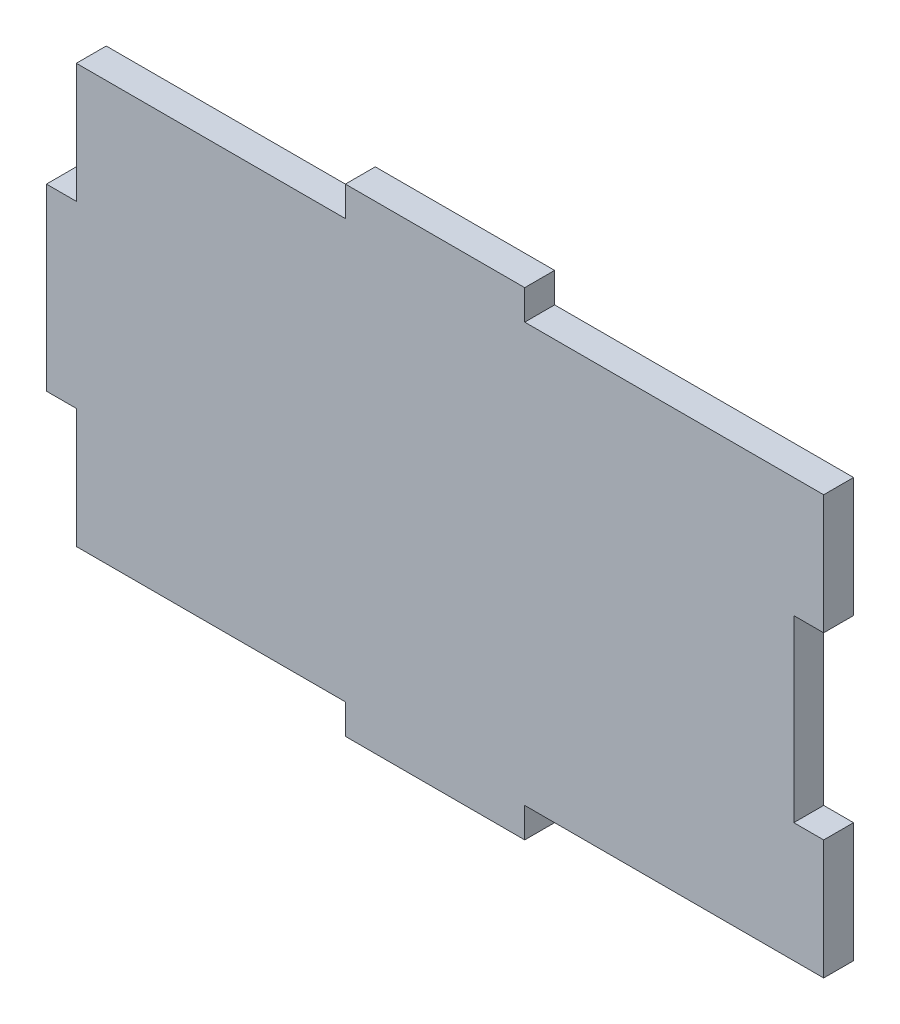
ISO-10303-21;
HEADER;
FILE_DESCRIPTION(('STEP AP214'),'2;1');
FILE_NAME('part.step','',(''),(''),'','','');
FILE_SCHEMA(('AUTOMOTIVE_DESIGN { 1 0 10303 214 1 1 1 1 }'));
ENDSEC;
DATA;
#1=APPLICATION_CONTEXT('core data for automotive mechanical design processes');
#2=APPLICATION_PROTOCOL_DEFINITION('international standard','automotive_design',2000,#1);
#3=PRODUCT_CONTEXT('',#1,'mechanical');
#4=PRODUCT('Part','Part','',(#3));
#5=PRODUCT_RELATED_PRODUCT_CATEGORY('part','',(#4));
#6=PRODUCT_DEFINITION_FORMATION('','',#4);
#7=PRODUCT_DEFINITION_CONTEXT('part definition',#1,'design');
#8=PRODUCT_DEFINITION('design','',#6,#7);
#9=PRODUCT_DEFINITION_SHAPE('','',#8);
#10=(LENGTH_UNIT() NAMED_UNIT(*) SI_UNIT(.MILLI.,.METRE.));
#11=(NAMED_UNIT(*) PLANE_ANGLE_UNIT() SI_UNIT($,.RADIAN.));
#12=(NAMED_UNIT(*) SI_UNIT($,.STERADIAN.) SOLID_ANGLE_UNIT());
#13=UNCERTAINTY_MEASURE_WITH_UNIT(LENGTH_MEASURE(1.E-05),#10,'distance_accuracy_value','');
#14=(GEOMETRIC_REPRESENTATION_CONTEXT(3) GLOBAL_UNCERTAINTY_ASSIGNED_CONTEXT((#13)) GLOBAL_UNIT_ASSIGNED_CONTEXT((#10,
#11,#12)) REPRESENTATION_CONTEXT('',''));
#15=CARTESIAN_POINT('',(0.,0.,0.));
#16=DIRECTION('',(0.,0.,1.));
#17=DIRECTION('',(1.,0.,0.));
#18=AXIS2_PLACEMENT_3D('',#15,#16,#17);
#19=CARTESIAN_POINT('',(79.375,0.,3.175));
#20=DIRECTION('',(-1.,0.,0.));
#21=DIRECTION('',(0.,-1.,0.));
#22=AXIS2_PLACEMENT_3D('',#19,#20,#21);
#23=PLANE('',#22);
#24=DIRECTION('',(0.,1.,0.));
#25=VECTOR('',#24,1.);
#26=CARTESIAN_POINT('',(79.375,0.,0.));
#27=LINE('',#26,#25);
#28=CARTESIAN_POINT('',(79.375,0.,0.));
#29=VERTEX_POINT('',#28);
#30=CARTESIAN_POINT('',(79.375,12.7,0.));
#31=VERTEX_POINT('',#30);
#32=EDGE_CURVE('E197',#29,#31,#27,.T.);
#33=ORIENTED_EDGE('',*,*,#32,.T.);
#34=DIRECTION('',(0.,0.,1.));
#35=VECTOR('',#34,1.);
#36=CARTESIAN_POINT('',(79.375,12.7,0.));
#37=LINE('',#36,#35);
#38=CARTESIAN_POINT('',(79.375,12.7,3.175));
#39=VERTEX_POINT('',#38);
#40=EDGE_CURVE('E381',#31,#39,#37,.T.);
#41=ORIENTED_EDGE('',*,*,#40,.T.);
#42=DIRECTION('',(0.,1.,0.));
#43=VECTOR('',#42,1.);
#44=CARTESIAN_POINT('',(79.375,0.,3.175));
#45=LINE('',#44,#43);
#46=CARTESIAN_POINT('',(79.375,0.,3.175));
#47=VERTEX_POINT('',#46);
#48=EDGE_CURVE('E297',#47,#39,#45,.T.);
#49=ORIENTED_EDGE('',*,*,#48,.F.);
#50=DIRECTION('',(0.,0.,-1.));
#51=VECTOR('',#50,1.);
#52=CARTESIAN_POINT('',(79.375,0.,3.175));
#53=LINE('',#52,#51);
#54=EDGE_CURVE('E42',#47,#29,#53,.T.);
#55=ORIENTED_EDGE('',*,*,#54,.T.);
#56=EDGE_LOOP('',(#33,#41,#49,#55));
#57=FACE_BOUND('',#56,.T.);
#58=ADVANCED_FACE('F33',(#57),#23,.F.);
#59=CARTESIAN_POINT('',(0.,0.,3.175));
#60=DIRECTION('',(0.,1.,0.));
#61=DIRECTION('',(0.,0.,1.));
#62=AXIS2_PLACEMENT_3D('',#59,#60,#61);
#63=PLANE('',#62);
#64=DIRECTION('',(0.,0.,1.));
#65=VECTOR('',#64,1.);
#66=CARTESIAN_POINT('',(47.625,0.,0.));
#67=LINE('',#66,#65);
#68=CARTESIAN_POINT('',(47.625,0.,0.));
#69=VERTEX_POINT('',#68);
#70=CARTESIAN_POINT('',(47.625,0.,3.175));
#71=VERTEX_POINT('',#70);
#72=EDGE_CURVE('E285',#69,#71,#67,.T.);
#73=ORIENTED_EDGE('',*,*,#72,.F.);
#74=DIRECTION('',(1.,0.,0.));
#75=VECTOR('',#74,1.);
#76=CARTESIAN_POINT('',(0.,0.,0.));
#77=LINE('',#76,#75);
#78=EDGE_CURVE('E203',#69,#29,#77,.T.);
#79=ORIENTED_EDGE('',*,*,#78,.T.);
#80=ORIENTED_EDGE('',*,*,#54,.F.);
#81=DIRECTION('',(1.,0.,0.));
#82=VECTOR('',#81,1.);
#83=CARTESIAN_POINT('',(0.,0.,3.175));
#84=LINE('',#83,#82);
#85=EDGE_CURVE('E293',#71,#47,#84,.T.);
#86=ORIENTED_EDGE('',*,*,#85,.F.);
#87=EDGE_LOOP('',(#73,#79,#80,#86));
#88=FACE_BOUND('',#87,.T.);
#89=ADVANCED_FACE('F398',(#88),#63,.F.);
#90=CARTESIAN_POINT('',(0.,44.45,3.175));
#91=DIRECTION('',(0.,-1.,0.));
#92=DIRECTION('',(0.,0.,-1.));
#93=AXIS2_PLACEMENT_3D('',#90,#91,#92);
#94=PLANE('',#93);
#95=DIRECTION('',(0.,0.,1.));
#96=VECTOR('',#95,1.);
#97=CARTESIAN_POINT('',(28.575,44.45,0.));
#98=LINE('',#97,#96);
#99=CARTESIAN_POINT('',(28.575,44.45,0.));
#100=VERTEX_POINT('',#99);
#101=CARTESIAN_POINT('',(28.575,44.45,3.175));
#102=VERTEX_POINT('',#101);
#103=EDGE_CURVE('E268',#100,#102,#98,.T.);
#104=ORIENTED_EDGE('',*,*,#103,.F.);
#105=DIRECTION('',(-1.,0.,0.));
#106=VECTOR('',#105,1.);
#107=CARTESIAN_POINT('',(0.,44.45,0.));
#108=LINE('',#107,#106);
#109=CARTESIAN_POINT('',(0.,44.45,0.));
#110=VERTEX_POINT('',#109);
#111=EDGE_CURVE('E201',#100,#110,#108,.T.);
#112=ORIENTED_EDGE('',*,*,#111,.T.);
#113=DIRECTION('',(0.,0.,-1.));
#114=VECTOR('',#113,1.);
#115=CARTESIAN_POINT('',(0.,44.45,3.175));
#116=LINE('',#115,#114);
#117=CARTESIAN_POINT('',(0.,44.45,3.175));
#118=VERTEX_POINT('',#117);
#119=EDGE_CURVE('E211',#118,#110,#116,.T.);
#120=ORIENTED_EDGE('',*,*,#119,.F.);
#121=DIRECTION('',(-1.,0.,0.));
#122=VECTOR('',#121,1.);
#123=CARTESIAN_POINT('',(0.,44.45,3.175));
#124=LINE('',#123,#122);
#125=EDGE_CURVE('E301',#102,#118,#124,.T.);
#126=ORIENTED_EDGE('',*,*,#125,.F.);
#127=EDGE_LOOP('',(#104,#112,#120,#126));
#128=FACE_BOUND('',#127,.T.);
#129=ADVANCED_FACE('F325',(#128),#94,.F.);
#130=CARTESIAN_POINT('',(0.,0.,3.175));
#131=DIRECTION('',(1.,0.,0.));
#132=DIRECTION('',(0.,1.,0.));
#133=AXIS2_PLACEMENT_3D('',#130,#131,#132);
#134=PLANE('',#133);
#135=DIRECTION('',(0.,0.,1.));
#136=VECTOR('',#135,1.);
#137=CARTESIAN_POINT('',(0.,12.7,0.));
#138=LINE('',#137,#136);
#139=CARTESIAN_POINT('',(0.,12.7,0.));
#140=VERTEX_POINT('',#139);
#141=CARTESIAN_POINT('',(0.,12.7,3.175));
#142=VERTEX_POINT('',#141);
#143=EDGE_CURVE('E232',#140,#142,#138,.T.);
#144=ORIENTED_EDGE('',*,*,#143,.F.);
#145=DIRECTION('',(0.,-1.,0.));
#146=VECTOR('',#145,1.);
#147=CARTESIAN_POINT('',(0.,0.,0.));
#148=LINE('',#147,#146);
#149=CARTESIAN_POINT('',(0.,0.,0.));
#150=VERTEX_POINT('',#149);
#151=EDGE_CURVE('E235',#140,#150,#148,.T.);
#152=ORIENTED_EDGE('',*,*,#151,.T.);
#153=DIRECTION('',(0.,0.,-1.));
#154=VECTOR('',#153,1.);
#155=CARTESIAN_POINT('',(0.,0.,3.175));
#156=LINE('',#155,#154);
#157=CARTESIAN_POINT('',(0.,0.,3.175));
#158=VERTEX_POINT('',#157);
#159=EDGE_CURVE('E11',#158,#150,#156,.T.);
#160=ORIENTED_EDGE('',*,*,#159,.F.);
#161=DIRECTION('',(0.,-1.,0.));
#162=VECTOR('',#161,1.);
#163=CARTESIAN_POINT('',(0.,0.,3.175));
#164=LINE('',#163,#162);
#165=EDGE_CURVE('E218',#142,#158,#164,.T.);
#166=ORIENTED_EDGE('',*,*,#165,.F.);
#167=EDGE_LOOP('',(#144,#152,#160,#166));
#168=FACE_BOUND('',#167,.T.);
#169=ADVANCED_FACE('F409',(#168),#134,.F.);
#170=CARTESIAN_POINT('',(0.,31.75,0.));
#171=VERTEX_POINT('',#170);
#172=EDGE_CURVE('E289',#110,#171,#148,.T.);
#173=ORIENTED_EDGE('',*,*,#172,.T.);
#174=DIRECTION('',(0.,0.,1.));
#175=VECTOR('',#174,1.);
#176=CARTESIAN_POINT('',(0.,31.75,0.));
#177=LINE('',#176,#175);
#178=CARTESIAN_POINT('',(0.,31.75,3.175));
#179=VERTEX_POINT('',#178);
#180=EDGE_CURVE('E230',#171,#179,#177,.T.);
#181=ORIENTED_EDGE('',*,*,#180,.T.);
#182=EDGE_CURVE('E320',#118,#179,#164,.T.);
#183=ORIENTED_EDGE('',*,*,#182,.F.);
#184=ORIENTED_EDGE('',*,*,#119,.T.);
#185=EDGE_LOOP('',(#173,#181,#183,#184));
#186=FACE_BOUND('',#185,.T.);
#187=ADVANCED_FACE('F35',(#186),#134,.F.);
#188=CARTESIAN_POINT('',(28.575,0.,0.));
#189=VERTEX_POINT('',#188);
#190=EDGE_CURVE('E198',#150,#189,#77,.T.);
#191=ORIENTED_EDGE('',*,*,#190,.T.);
#192=DIRECTION('',(0.,0.,1.));
#193=VECTOR('',#192,1.);
#194=CARTESIAN_POINT('',(28.575,0.,0.));
#195=LINE('',#194,#193);
#196=CARTESIAN_POINT('',(28.575,0.,3.175));
#197=VERTEX_POINT('',#196);
#198=EDGE_CURVE('E350',#189,#197,#195,.T.);
#199=ORIENTED_EDGE('',*,*,#198,.T.);
#200=EDGE_CURVE('E290',#158,#197,#84,.T.);
#201=ORIENTED_EDGE('',*,*,#200,.F.);
#202=ORIENTED_EDGE('',*,*,#159,.T.);
#203=EDGE_LOOP('',(#191,#199,#201,#202));
#204=FACE_BOUND('',#203,.T.);
#205=ADVANCED_FACE('F412',(#204),#63,.F.);
#206=CARTESIAN_POINT('',(79.375,31.75,3.175));
#207=VERTEX_POINT('',#206);
#208=CARTESIAN_POINT('',(79.375,44.45,3.175));
#209=VERTEX_POINT('',#208);
#210=EDGE_CURVE('E188',#207,#209,#45,.T.);
#211=ORIENTED_EDGE('',*,*,#210,.F.);
#212=DIRECTION('',(0.,0.,1.));
#213=VECTOR('',#212,1.);
#214=CARTESIAN_POINT('',(79.375,31.75,0.));
#215=LINE('',#214,#213);
#216=CARTESIAN_POINT('',(79.375,31.75,0.));
#217=VERTEX_POINT('',#216);
#218=EDGE_CURVE('E175',#217,#207,#215,.T.);
#219=ORIENTED_EDGE('',*,*,#218,.F.);
#220=CARTESIAN_POINT('',(79.375,44.45,0.));
#221=VERTEX_POINT('',#220);
#222=EDGE_CURVE('E186',#217,#221,#27,.T.);
#223=ORIENTED_EDGE('',*,*,#222,.T.);
#224=DIRECTION('',(0.,0.,-1.));
#225=VECTOR('',#224,1.);
#226=CARTESIAN_POINT('',(79.375,44.45,3.175));
#227=LINE('',#226,#225);
#228=EDGE_CURVE('E313',#209,#221,#227,.T.);
#229=ORIENTED_EDGE('',*,*,#228,.F.);
#230=EDGE_LOOP('',(#211,#219,#223,#229));
#231=FACE_BOUND('',#230,.T.);
#232=ADVANCED_FACE('F184',(#231),#23,.F.);
#233=CARTESIAN_POINT('',(47.625,44.45,0.));
#234=VERTEX_POINT('',#233);
#235=EDGE_CURVE('E196',#221,#234,#108,.T.);
#236=ORIENTED_EDGE('',*,*,#235,.T.);
#237=DIRECTION('',(0.,0.,1.));
#238=VECTOR('',#237,1.);
#239=CARTESIAN_POINT('',(47.625,44.45,0.));
#240=LINE('',#239,#238);
#241=CARTESIAN_POINT('',(47.625,44.45,3.175));
#242=VERTEX_POINT('',#241);
#243=EDGE_CURVE('E271',#234,#242,#240,.T.);
#244=ORIENTED_EDGE('',*,*,#243,.T.);
#245=EDGE_CURVE('E307',#209,#242,#124,.T.);
#246=ORIENTED_EDGE('',*,*,#245,.F.);
#247=ORIENTED_EDGE('',*,*,#228,.T.);
#248=EDGE_LOOP('',(#236,#244,#246,#247));
#249=FACE_BOUND('',#248,.T.);
#250=ADVANCED_FACE('F418',(#249),#94,.F.);
#251=CARTESIAN_POINT('',(0.,0.,3.175));
#252=DIRECTION('',(0.,0.,-1.));
#253=DIRECTION('',(-1.,0.,0.));
#254=AXIS2_PLACEMENT_3D('',#251,#252,#253);
#255=PLANE('',#254);
#256=ORIENTED_EDGE('',*,*,#48,.T.);
#257=DIRECTION('',(1.,0.,0.));
#258=VECTOR('',#257,1.);
#259=CARTESIAN_POINT('',(79.375,12.7,3.175));
#260=LINE('',#259,#258);
#261=CARTESIAN_POINT('',(76.2,12.7,3.175));
#262=VERTEX_POINT('',#261);
#263=EDGE_CURVE('E180',#262,#39,#260,.T.);
#264=ORIENTED_EDGE('',*,*,#263,.F.);
#265=DIRECTION('',(0.,-1.,0.));
#266=VECTOR('',#265,1.);
#267=CARTESIAN_POINT('',(76.2,12.7,3.175));
#268=LINE('',#267,#266);
#269=CARTESIAN_POINT('',(76.2,31.75,3.175));
#270=VERTEX_POINT('',#269);
#271=EDGE_CURVE('E472',#270,#262,#268,.T.);
#272=ORIENTED_EDGE('',*,*,#271,.F.);
#273=DIRECTION('',(-1.,0.,0.));
#274=VECTOR('',#273,1.);
#275=CARTESIAN_POINT('',(79.375,31.75,3.175));
#276=LINE('',#275,#274);
#277=EDGE_CURVE('E473',#207,#270,#276,.T.);
#278=ORIENTED_EDGE('',*,*,#277,.F.);
#279=ORIENTED_EDGE('',*,*,#210,.T.);
#280=ORIENTED_EDGE('',*,*,#245,.T.);
#281=DIRECTION('',(0.,1.,0.));
#282=VECTOR('',#281,1.);
#283=CARTESIAN_POINT('',(47.625,44.45,3.175));
#284=LINE('',#283,#282);
#285=CARTESIAN_POINT('',(47.625,47.625,3.175));
#286=VERTEX_POINT('',#285);
#287=EDGE_CURVE('E284',#242,#286,#284,.T.);
#288=ORIENTED_EDGE('',*,*,#287,.T.);
#289=DIRECTION('',(-1.,0.,0.));
#290=VECTOR('',#289,1.);
#291=CARTESIAN_POINT('',(28.575,47.625,3.175));
#292=LINE('',#291,#290);
#293=CARTESIAN_POINT('',(28.575,47.625,3.175));
#294=VERTEX_POINT('',#293);
#295=EDGE_CURVE('E278',#286,#294,#292,.T.);
#296=ORIENTED_EDGE('',*,*,#295,.T.);
#297=DIRECTION('',(0.,-1.,0.));
#298=VECTOR('',#297,1.);
#299=CARTESIAN_POINT('',(28.575,44.45,3.175));
#300=LINE('',#299,#298);
#301=EDGE_CURVE('E281',#294,#102,#300,.T.);
#302=ORIENTED_EDGE('',*,*,#301,.T.);
#303=ORIENTED_EDGE('',*,*,#125,.T.);
#304=ORIENTED_EDGE('',*,*,#182,.T.);
#305=DIRECTION('',(-1.,0.,0.));
#306=VECTOR('',#305,1.);
#307=CARTESIAN_POINT('',(0.,31.75,3.175));
#308=LINE('',#307,#306);
#309=CARTESIAN_POINT('',(-3.175,31.75,3.175));
#310=VERTEX_POINT('',#309);
#311=EDGE_CURVE('E334',#179,#310,#308,.T.);
#312=ORIENTED_EDGE('',*,*,#311,.T.);
#313=DIRECTION('',(0.,-1.,0.));
#314=VECTOR('',#313,1.);
#315=CARTESIAN_POINT('',(-3.175,31.75,3.175));
#316=LINE('',#315,#314);
#317=CARTESIAN_POINT('',(-3.175,12.7,3.175));
#318=VERTEX_POINT('',#317);
#319=EDGE_CURVE('E225',#310,#318,#316,.T.);
#320=ORIENTED_EDGE('',*,*,#319,.T.);
#321=DIRECTION('',(1.,0.,0.));
#322=VECTOR('',#321,1.);
#323=CARTESIAN_POINT('',(0.,12.7,3.175));
#324=LINE('',#323,#322);
#325=EDGE_CURVE('E221',#318,#142,#324,.T.);
#326=ORIENTED_EDGE('',*,*,#325,.T.);
#327=ORIENTED_EDGE('',*,*,#165,.T.);
#328=ORIENTED_EDGE('',*,*,#200,.T.);
#329=DIRECTION('',(0.,-1.,0.));
#330=VECTOR('',#329,1.);
#331=CARTESIAN_POINT('',(28.575,0.,3.175));
#332=LINE('',#331,#330);
#333=CARTESIAN_POINT('',(28.575,-3.17499999999998,3.175));
#334=VERTEX_POINT('',#333);
#335=EDGE_CURVE('E58',#197,#334,#332,.T.);
#336=ORIENTED_EDGE('',*,*,#335,.T.);
#337=DIRECTION('',(1.,0.,0.));
#338=VECTOR('',#337,1.);
#339=CARTESIAN_POINT('',(28.575,-3.17499999999998,3.175));
#340=LINE('',#339,#338);
#341=CARTESIAN_POINT('',(47.625,-3.17499999999999,3.175));
#342=VERTEX_POINT('',#341);
#343=EDGE_CURVE('E368',#334,#342,#340,.T.);
#344=ORIENTED_EDGE('',*,*,#343,.T.);
#345=DIRECTION('',(0.,1.,0.));
#346=VECTOR('',#345,1.);
#347=CARTESIAN_POINT('',(47.625,0.,3.175));
#348=LINE('',#347,#346);
#349=EDGE_CURVE('E359',#342,#71,#348,.T.);
#350=ORIENTED_EDGE('',*,*,#349,.T.);
#351=ORIENTED_EDGE('',*,*,#85,.T.);
#352=EDGE_LOOP('',(#256,#264,#272,#278,#279,#280,#288,#296,#302,#303,#304,#312,#320,#326,#327,
#328,#336,#344,#350,#351));
#353=FACE_BOUND('',#352,.T.);
#354=ADVANCED_FACE('F317',(#353),#255,.F.);
#355=CARTESIAN_POINT('',(0.,0.,0.));
#356=DIRECTION('',(0.,0.,-1.));
#357=DIRECTION('',(-1.,0.,0.));
#358=AXIS2_PLACEMENT_3D('',#355,#356,#357);
#359=PLANE('',#358);
#360=DIRECTION('',(1.,0.,0.));
#361=VECTOR('',#360,1.);
#362=CARTESIAN_POINT('',(79.375,12.7,0.));
#363=LINE('',#362,#361);
#364=CARTESIAN_POINT('',(76.2,12.7,0.));
#365=VERTEX_POINT('',#364);
#366=EDGE_CURVE('E189',#365,#31,#363,.T.);
#367=ORIENTED_EDGE('',*,*,#366,.T.);
#368=ORIENTED_EDGE('',*,*,#32,.F.);
#369=ORIENTED_EDGE('',*,*,#78,.F.);
#370=DIRECTION('',(0.,1.,0.));
#371=VECTOR('',#370,1.);
#372=CARTESIAN_POINT('',(47.625,0.,0.));
#373=LINE('',#372,#371);
#374=CARTESIAN_POINT('',(47.625,-3.17499999999999,0.));
#375=VERTEX_POINT('',#374);
#376=EDGE_CURVE('E353',#375,#69,#373,.T.);
#377=ORIENTED_EDGE('',*,*,#376,.F.);
#378=DIRECTION('',(1.,0.,0.));
#379=VECTOR('',#378,1.);
#380=CARTESIAN_POINT('',(28.575,-3.17499999999998,0.));
#381=LINE('',#380,#379);
#382=CARTESIAN_POINT('',(28.575,-3.17499999999998,0.));
#383=VERTEX_POINT('',#382);
#384=EDGE_CURVE('E358',#383,#375,#381,.T.);
#385=ORIENTED_EDGE('',*,*,#384,.F.);
#386=DIRECTION('',(0.,-1.,0.));
#387=VECTOR('',#386,1.);
#388=CARTESIAN_POINT('',(28.575,0.,0.));
#389=LINE('',#388,#387);
#390=EDGE_CURVE('E355',#189,#383,#389,.T.);
#391=ORIENTED_EDGE('',*,*,#390,.F.);
#392=ORIENTED_EDGE('',*,*,#190,.F.);
#393=ORIENTED_EDGE('',*,*,#151,.F.);
#394=DIRECTION('',(1.,0.,0.));
#395=VECTOR('',#394,1.);
#396=CARTESIAN_POINT('',(0.,12.7,0.));
#397=LINE('',#396,#395);
#398=CARTESIAN_POINT('',(-3.175,12.7,0.));
#399=VERTEX_POINT('',#398);
#400=EDGE_CURVE('E228',#399,#140,#397,.T.);
#401=ORIENTED_EDGE('',*,*,#400,.F.);
#402=DIRECTION('',(0.,-1.,0.));
#403=VECTOR('',#402,1.);
#404=CARTESIAN_POINT('',(-3.175,31.75,0.));
#405=LINE('',#404,#403);
#406=CARTESIAN_POINT('',(-3.175,31.75,0.));
#407=VERTEX_POINT('',#406);
#408=EDGE_CURVE('E231',#407,#399,#405,.T.);
#409=ORIENTED_EDGE('',*,*,#408,.F.);
#410=DIRECTION('',(-1.,0.,0.));
#411=VECTOR('',#410,1.);
#412=CARTESIAN_POINT('',(0.,31.75,0.));
#413=LINE('',#412,#411);
#414=EDGE_CURVE('E224',#171,#407,#413,.T.);
#415=ORIENTED_EDGE('',*,*,#414,.F.);
#416=ORIENTED_EDGE('',*,*,#172,.F.);
#417=ORIENTED_EDGE('',*,*,#111,.F.);
#418=DIRECTION('',(0.,-1.,0.));
#419=VECTOR('',#418,1.);
#420=CARTESIAN_POINT('',(28.575,44.45,0.));
#421=LINE('',#420,#419);
#422=CARTESIAN_POINT('',(28.575,47.625,0.));
#423=VERTEX_POINT('',#422);
#424=EDGE_CURVE('E275',#423,#100,#421,.T.);
#425=ORIENTED_EDGE('',*,*,#424,.F.);
#426=DIRECTION('',(-1.,0.,0.));
#427=VECTOR('',#426,1.);
#428=CARTESIAN_POINT('',(28.575,47.625,0.));
#429=LINE('',#428,#427);
#430=CARTESIAN_POINT('',(47.625,47.625,0.));
#431=VERTEX_POINT('',#430);
#432=EDGE_CURVE('E272',#431,#423,#429,.T.);
#433=ORIENTED_EDGE('',*,*,#432,.F.);
#434=DIRECTION('',(0.,1.,0.));
#435=VECTOR('',#434,1.);
#436=CARTESIAN_POINT('',(47.625,44.45,0.));
#437=LINE('',#436,#435);
#438=EDGE_CURVE('E277',#234,#431,#437,.T.);
#439=ORIENTED_EDGE('',*,*,#438,.F.);
#440=ORIENTED_EDGE('',*,*,#235,.F.);
#441=ORIENTED_EDGE('',*,*,#222,.F.);
#442=DIRECTION('',(-1.,0.,0.));
#443=VECTOR('',#442,1.);
#444=CARTESIAN_POINT('',(79.375,31.75,0.));
#445=LINE('',#444,#443);
#446=CARTESIAN_POINT('',(76.2,31.75,0.));
#447=VERTEX_POINT('',#446);
#448=EDGE_CURVE('E171',#217,#447,#445,.T.);
#449=ORIENTED_EDGE('',*,*,#448,.T.);
#450=DIRECTION('',(0.,-1.,0.));
#451=VECTOR('',#450,1.);
#452=CARTESIAN_POINT('',(76.2,12.7,0.));
#453=LINE('',#452,#451);
#454=EDGE_CURVE('E50',#447,#365,#453,.T.);
#455=ORIENTED_EDGE('',*,*,#454,.T.);
#456=EDGE_LOOP('',(#367,#368,#369,#377,#385,#391,#392,#393,#401,#409,#415,#416,#417,#425,#433,
#439,#440,#441,#449,#455));
#457=FACE_BOUND('',#456,.T.);
#458=ADVANCED_FACE('F193',(#457),#359,.T.);
#459=CARTESIAN_POINT('',(0.,12.7,0.));
#460=DIRECTION('',(0.,-1.,0.));
#461=DIRECTION('',(0.,0.,-1.));
#462=AXIS2_PLACEMENT_3D('',#459,#460,#461);
#463=PLANE('',#462);
#464=ORIENTED_EDGE('',*,*,#325,.F.);
#465=DIRECTION('',(0.,0.,1.));
#466=VECTOR('',#465,1.);
#467=CARTESIAN_POINT('',(-3.175,12.7,0.));
#468=LINE('',#467,#466);
#469=EDGE_CURVE('E236',#399,#318,#468,.T.);
#470=ORIENTED_EDGE('',*,*,#469,.F.);
#471=ORIENTED_EDGE('',*,*,#400,.T.);
#472=ORIENTED_EDGE('',*,*,#143,.T.);
#473=EDGE_LOOP('',(#464,#470,#471,#472));
#474=FACE_BOUND('',#473,.T.);
#475=ADVANCED_FACE('F430',(#474),#463,.T.);
#476=CARTESIAN_POINT('',(-3.175,31.75,0.));
#477=DIRECTION('',(-1.,0.,0.));
#478=DIRECTION('',(0.,-1.,0.));
#479=AXIS2_PLACEMENT_3D('',#476,#477,#478);
#480=PLANE('',#479);
#481=ORIENTED_EDGE('',*,*,#319,.F.);
#482=DIRECTION('',(0.,0.,1.));
#483=VECTOR('',#482,1.);
#484=CARTESIAN_POINT('',(-3.175,31.75,0.));
#485=LINE('',#484,#483);
#486=EDGE_CURVE('E244',#407,#310,#485,.T.);
#487=ORIENTED_EDGE('',*,*,#486,.F.);
#488=ORIENTED_EDGE('',*,*,#408,.T.);
#489=ORIENTED_EDGE('',*,*,#469,.T.);
#490=EDGE_LOOP('',(#481,#487,#488,#489));
#491=FACE_BOUND('',#490,.T.);
#492=ADVANCED_FACE('F437',(#491),#480,.T.);
#493=CARTESIAN_POINT('',(0.,31.75,0.));
#494=DIRECTION('',(0.,1.,0.));
#495=DIRECTION('',(0.,0.,1.));
#496=AXIS2_PLACEMENT_3D('',#493,#494,#495);
#497=PLANE('',#496);
#498=ORIENTED_EDGE('',*,*,#311,.F.);
#499=ORIENTED_EDGE('',*,*,#180,.F.);
#500=ORIENTED_EDGE('',*,*,#414,.T.);
#501=ORIENTED_EDGE('',*,*,#486,.T.);
#502=EDGE_LOOP('',(#498,#499,#500,#501));
#503=FACE_BOUND('',#502,.T.);
#504=ADVANCED_FACE('F433',(#503),#497,.T.);
#505=CARTESIAN_POINT('',(28.575,44.45,0.));
#506=DIRECTION('',(-1.,0.,0.));
#507=DIRECTION('',(0.,0.,1.));
#508=AXIS2_PLACEMENT_3D('',#505,#506,#507);
#509=PLANE('',#508);
#510=ORIENTED_EDGE('',*,*,#301,.F.);
#511=DIRECTION('',(0.,0.,1.));
#512=VECTOR('',#511,1.);
#513=CARTESIAN_POINT('',(28.575,47.625,0.));
#514=LINE('',#513,#512);
#515=EDGE_CURVE('E335',#423,#294,#514,.T.);
#516=ORIENTED_EDGE('',*,*,#515,.F.);
#517=ORIENTED_EDGE('',*,*,#424,.T.);
#518=ORIENTED_EDGE('',*,*,#103,.T.);
#519=EDGE_LOOP('',(#510,#516,#517,#518));
#520=FACE_BOUND('',#519,.T.);
#521=ADVANCED_FACE('F436',(#520),#509,.T.);
#522=CARTESIAN_POINT('',(28.575,47.625,0.));
#523=DIRECTION('',(0.,1.,0.));
#524=DIRECTION('',(0.,0.,1.));
#525=AXIS2_PLACEMENT_3D('',#522,#523,#524);
#526=PLANE('',#525);
#527=ORIENTED_EDGE('',*,*,#295,.F.);
#528=DIRECTION('',(0.,0.,1.));
#529=VECTOR('',#528,1.);
#530=CARTESIAN_POINT('',(47.625,47.625,0.));
#531=LINE('',#530,#529);
#532=EDGE_CURVE('E337',#431,#286,#531,.T.);
#533=ORIENTED_EDGE('',*,*,#532,.F.);
#534=ORIENTED_EDGE('',*,*,#432,.T.);
#535=ORIENTED_EDGE('',*,*,#515,.T.);
#536=EDGE_LOOP('',(#527,#533,#534,#535));
#537=FACE_BOUND('',#536,.T.);
#538=ADVANCED_FACE('F445',(#537),#526,.T.);
#539=CARTESIAN_POINT('',(47.625,44.45,0.));
#540=DIRECTION('',(1.,0.,0.));
#541=DIRECTION('',(0.,1.,0.));
#542=AXIS2_PLACEMENT_3D('',#539,#540,#541);
#543=PLANE('',#542);
#544=ORIENTED_EDGE('',*,*,#287,.F.);
#545=ORIENTED_EDGE('',*,*,#243,.F.);
#546=ORIENTED_EDGE('',*,*,#438,.T.);
#547=ORIENTED_EDGE('',*,*,#532,.T.);
#548=EDGE_LOOP('',(#544,#545,#546,#547));
#549=FACE_BOUND('',#548,.T.);
#550=ADVANCED_FACE('F447',(#549),#543,.T.);
#551=CARTESIAN_POINT('',(47.625,0.,0.));
#552=DIRECTION('',(1.,0.,0.));
#553=DIRECTION('',(0.,1.,0.));
#554=AXIS2_PLACEMENT_3D('',#551,#552,#553);
#555=PLANE('',#554);
#556=ORIENTED_EDGE('',*,*,#349,.F.);
#557=DIRECTION('',(0.,0.,1.));
#558=VECTOR('',#557,1.);
#559=CARTESIAN_POINT('',(47.625,-3.17499999999999,0.));
#560=LINE('',#559,#558);
#561=EDGE_CURVE('E364',#375,#342,#560,.T.);
#562=ORIENTED_EDGE('',*,*,#561,.F.);
#563=ORIENTED_EDGE('',*,*,#376,.T.);
#564=ORIENTED_EDGE('',*,*,#72,.T.);
#565=EDGE_LOOP('',(#556,#562,#563,#564));
#566=FACE_BOUND('',#565,.T.);
#567=ADVANCED_FACE('F394',(#566),#555,.T.);
#568=CARTESIAN_POINT('',(28.575,-3.17499999999998,0.));
#569=DIRECTION('',(0.,-1.,0.));
#570=DIRECTION('',(1.,0.,0.));
#571=AXIS2_PLACEMENT_3D('',#568,#569,#570);
#572=PLANE('',#571);
#573=ORIENTED_EDGE('',*,*,#343,.F.);
#574=DIRECTION('',(0.,0.,1.));
#575=VECTOR('',#574,1.);
#576=CARTESIAN_POINT('',(28.575,-3.17499999999998,0.));
#577=LINE('',#576,#575);
#578=EDGE_CURVE('E347',#383,#334,#577,.T.);
#579=ORIENTED_EDGE('',*,*,#578,.F.);
#580=ORIENTED_EDGE('',*,*,#384,.T.);
#581=ORIENTED_EDGE('',*,*,#561,.T.);
#582=EDGE_LOOP('',(#573,#579,#580,#581));
#583=FACE_BOUND('',#582,.T.);
#584=ADVANCED_FACE('F377',(#583),#572,.T.);
#585=CARTESIAN_POINT('',(28.575,0.,0.));
#586=DIRECTION('',(-1.,0.,0.));
#587=DIRECTION('',(0.,0.,1.));
#588=AXIS2_PLACEMENT_3D('',#585,#586,#587);
#589=PLANE('',#588);
#590=ORIENTED_EDGE('',*,*,#335,.F.);
#591=ORIENTED_EDGE('',*,*,#198,.F.);
#592=ORIENTED_EDGE('',*,*,#390,.T.);
#593=ORIENTED_EDGE('',*,*,#578,.T.);
#594=EDGE_LOOP('',(#590,#591,#592,#593));
#595=FACE_BOUND('',#594,.T.);
#596=ADVANCED_FACE('F374',(#595),#589,.T.);
#597=CARTESIAN_POINT('',(79.375,12.7,0.));
#598=DIRECTION('',(0.,-1.,0.));
#599=DIRECTION('',(1.,0.,0.));
#600=AXIS2_PLACEMENT_3D('',#597,#598,#599);
#601=PLANE('',#600);
#602=ORIENTED_EDGE('',*,*,#263,.T.);
#603=ORIENTED_EDGE('',*,*,#40,.F.);
#604=ORIENTED_EDGE('',*,*,#366,.F.);
#605=DIRECTION('',(0.,0.,1.));
#606=VECTOR('',#605,1.);
#607=CARTESIAN_POINT('',(76.2,12.7,0.));
#608=LINE('',#607,#606);
#609=EDGE_CURVE('E383',#365,#262,#608,.T.);
#610=ORIENTED_EDGE('',*,*,#609,.T.);
#611=EDGE_LOOP('',(#602,#603,#604,#610));
#612=FACE_BOUND('',#611,.T.);
#613=ADVANCED_FACE('F455',(#612),#601,.F.);
#614=CARTESIAN_POINT('',(76.2,12.7,0.));
#615=DIRECTION('',(-1.,0.,0.));
#616=DIRECTION('',(0.,-1.,0.));
#617=AXIS2_PLACEMENT_3D('',#614,#615,#616);
#618=PLANE('',#617);
#619=ORIENTED_EDGE('',*,*,#271,.T.);
#620=ORIENTED_EDGE('',*,*,#609,.F.);
#621=ORIENTED_EDGE('',*,*,#454,.F.);
#622=DIRECTION('',(0.,0.,1.));
#623=VECTOR('',#622,1.);
#624=CARTESIAN_POINT('',(76.2,31.75,0.));
#625=LINE('',#624,#623);
#626=EDGE_CURVE('E177',#447,#270,#625,.T.);
#627=ORIENTED_EDGE('',*,*,#626,.T.);
#628=EDGE_LOOP('',(#619,#620,#621,#627));
#629=FACE_BOUND('',#628,.T.);
#630=ADVANCED_FACE('F462',(#629),#618,.F.);
#631=CARTESIAN_POINT('',(79.375,31.75,0.));
#632=DIRECTION('',(0.,1.,0.));
#633=DIRECTION('',(0.,0.,1.));
#634=AXIS2_PLACEMENT_3D('',#631,#632,#633);
#635=PLANE('',#634);
#636=ORIENTED_EDGE('',*,*,#277,.T.);
#637=ORIENTED_EDGE('',*,*,#626,.F.);
#638=ORIENTED_EDGE('',*,*,#448,.F.);
#639=ORIENTED_EDGE('',*,*,#218,.T.);
#640=EDGE_LOOP('',(#636,#637,#638,#639));
#641=FACE_BOUND('',#640,.T.);
#642=ADVANCED_FACE('F174',(#641),#635,.F.);
#643=CLOSED_SHELL('',(#58,#89,#129,#169,#187,#205,#232,#250,#354,#458,#475,#492,#504,#521,#538,
#550,#567,#584,#596,#613,#630,#642));
#644=MANIFOLD_SOLID_BREP('B2',#643);
#645=ADVANCED_BREP_SHAPE_REPRESENTATION('',(#18,#644),#14);
#646=SHAPE_DEFINITION_REPRESENTATION(#9,#645);
ENDSEC;
END-ISO-10303-21;
